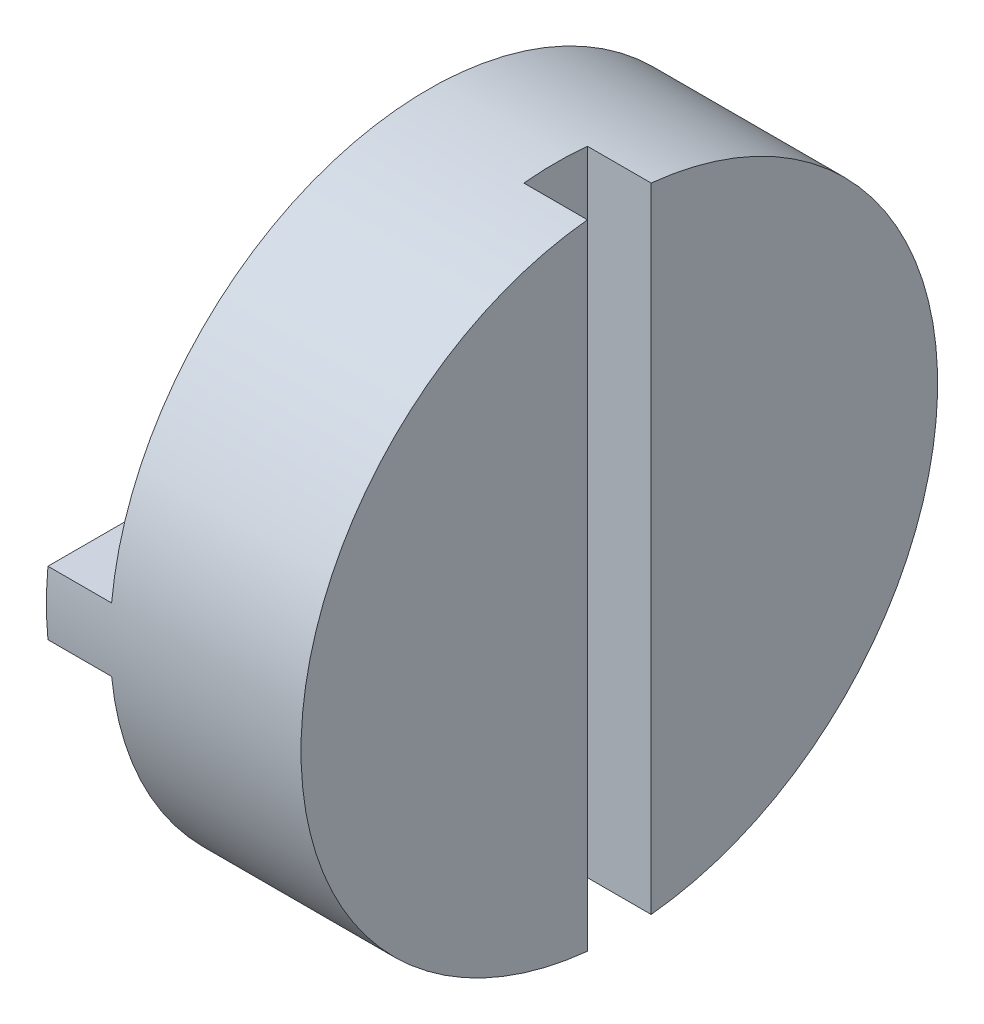
ISO-10303-21;
HEADER;
FILE_DESCRIPTION(('STEP AP214'),'2;1');
FILE_NAME('part.step','',(''),(''),'','','');
FILE_SCHEMA(('AUTOMOTIVE_DESIGN { 1 0 10303 214 1 1 1 1 }'));
ENDSEC;
DATA;
#1=APPLICATION_CONTEXT('core data for automotive mechanical design processes');
#2=APPLICATION_PROTOCOL_DEFINITION('international standard','automotive_design',2000,#1);
#3=PRODUCT_CONTEXT('',#1,'mechanical');
#4=PRODUCT('Part','Part','',(#3));
#5=PRODUCT_RELATED_PRODUCT_CATEGORY('part','',(#4));
#6=PRODUCT_DEFINITION_FORMATION('','',#4);
#7=PRODUCT_DEFINITION_CONTEXT('part definition',#1,'design');
#8=PRODUCT_DEFINITION('design','',#6,#7);
#9=PRODUCT_DEFINITION_SHAPE('','',#8);
#10=(LENGTH_UNIT() NAMED_UNIT(*) SI_UNIT(.MILLI.,.METRE.));
#11=(NAMED_UNIT(*) PLANE_ANGLE_UNIT() SI_UNIT($,.RADIAN.));
#12=(NAMED_UNIT(*) SI_UNIT($,.STERADIAN.) SOLID_ANGLE_UNIT());
#13=UNCERTAINTY_MEASURE_WITH_UNIT(LENGTH_MEASURE(1.E-05),#10,'distance_accuracy_value','');
#14=(GEOMETRIC_REPRESENTATION_CONTEXT(3) GLOBAL_UNCERTAINTY_ASSIGNED_CONTEXT((#13)) GLOBAL_UNIT_ASSIGNED_CONTEXT((#10,
#11,#12)) REPRESENTATION_CONTEXT('',''));
#15=CARTESIAN_POINT('',(0.,0.,0.));
#16=DIRECTION('',(0.,0.,1.));
#17=DIRECTION('',(1.,0.,0.));
#18=AXIS2_PLACEMENT_3D('',#15,#16,#17);
#19=CARTESIAN_POINT('',(-5.,0.,0.));
#20=DIRECTION('',(1.,0.,0.));
#21=DIRECTION('',(0.,0.,-1.));
#22=AXIS2_PLACEMENT_3D('',#19,#20,#21);
#23=PLANE('',#22);
#24=DIRECTION('',(0.,0.,1.));
#25=VECTOR('',#24,1.);
#26=CARTESIAN_POINT('',(-5.,-2.5,-24.8746859276655));
#27=LINE('',#26,#25);
#28=CARTESIAN_POINT('',(-5.,-2.5,-24.8746859276655));
#29=VERTEX_POINT('',#28);
#30=CARTESIAN_POINT('',(-5.,-2.5,24.8746859276655));
#31=VERTEX_POINT('',#30);
#32=EDGE_CURVE('E49',#29,#31,#27,.T.);
#33=ORIENTED_EDGE('',*,*,#32,.F.);
#34=CARTESIAN_POINT('',(-5.,0.,0.));
#35=DIRECTION('',(1.,0.,0.));
#36=DIRECTION('',(0.,0.,-1.));
#37=AXIS2_PLACEMENT_3D('',#34,#35,#36);
#38=CIRCLE('',#37,25.);
#39=EDGE_CURVE('E42',#31,#29,#38,.T.);
#40=ORIENTED_EDGE('',*,*,#39,.F.);
#41=EDGE_LOOP('',(#33,#40));
#42=FACE_BOUND('',#41,.T.);
#43=ADVANCED_FACE('F33',(#42),#23,.F.);
#44=DIRECTION('',(0.,0.,-1.));
#45=VECTOR('',#44,1.);
#46=CARTESIAN_POINT('',(-5.,2.5,-24.8746859276655));
#47=LINE('',#46,#45);
#48=CARTESIAN_POINT('',(-5.,2.5,24.8746859276655));
#49=VERTEX_POINT('',#48);
#50=CARTESIAN_POINT('',(-5.,2.5,-24.8746859276655));
#51=VERTEX_POINT('',#50);
#52=EDGE_CURVE('E130',#49,#51,#47,.T.);
#53=ORIENTED_EDGE('',*,*,#52,.F.);
#54=EDGE_CURVE('E11',#51,#49,#38,.T.);
#55=ORIENTED_EDGE('',*,*,#54,.F.);
#56=EDGE_LOOP('',(#53,#55));
#57=FACE_BOUND('',#56,.T.);
#58=ADVANCED_FACE('F185',(#57),#23,.F.);
#59=CARTESIAN_POINT('',(10.,0.,0.));
#60=DIRECTION('',(1.,0.,0.));
#61=DIRECTION('',(0.,0.,-1.));
#62=AXIS2_PLACEMENT_3D('',#59,#60,#61);
#63=PLANE('',#62);
#64=DIRECTION('',(0.,1.,0.));
#65=VECTOR('',#64,1.);
#66=CARTESIAN_POINT('',(10.,24.8746859276655,-2.5));
#67=LINE('',#66,#65);
#68=CARTESIAN_POINT('',(10.,-24.8746859276655,-2.49999999999999));
#69=VERTEX_POINT('',#68);
#70=CARTESIAN_POINT('',(10.,24.8746859276655,-2.5));
#71=VERTEX_POINT('',#70);
#72=EDGE_CURVE('E119',#69,#71,#67,.T.);
#73=ORIENTED_EDGE('',*,*,#72,.F.);
#74=CARTESIAN_POINT('',(10.,0.,0.));
#75=DIRECTION('',(1.,0.,0.));
#76=DIRECTION('',(0.,0.,-1.));
#77=AXIS2_PLACEMENT_3D('',#74,#75,#76);
#78=CIRCLE('',#77,25.);
#79=EDGE_CURVE('E154',#69,#71,#78,.T.);
#80=ORIENTED_EDGE('',*,*,#79,.T.);
#81=EDGE_LOOP('',(#73,#80));
#82=FACE_BOUND('',#81,.T.);
#83=ADVANCED_FACE('F189',(#82),#63,.T.);
#84=CARTESIAN_POINT('',(-5.,0.,0.));
#85=DIRECTION('',(1.,0.,0.));
#86=DIRECTION('',(0.,0.,-1.));
#87=AXIS2_PLACEMENT_3D('',#84,#85,#86);
#88=CYLINDRICAL_SURFACE('',#87,25.);
#89=DIRECTION('',(1.,0.,0.));
#90=VECTOR('',#89,1.);
#91=CARTESIAN_POINT('',(5.,-24.8746859276655,-2.49999999999999));
#92=LINE('',#91,#90);
#93=CARTESIAN_POINT('',(5.,-24.8746859276655,-2.49999999999999));
#94=VERTEX_POINT('',#93);
#95=EDGE_CURVE('E155',#94,#69,#92,.T.);
#96=ORIENTED_EDGE('',*,*,#95,.F.);
#97=CARTESIAN_POINT('',(5.,0.,0.));
#98=DIRECTION('',(1.,0.,0.));
#99=DIRECTION('',(0.,0.,-1.));
#100=AXIS2_PLACEMENT_3D('',#97,#98,#99);
#101=CIRCLE('',#100,25.);
#102=CARTESIAN_POINT('',(5.,-24.8746859276655,2.5));
#103=VERTEX_POINT('',#102);
#104=EDGE_CURVE('E144',#103,#94,#101,.T.);
#105=ORIENTED_EDGE('',*,*,#104,.F.);
#106=DIRECTION('',(1.,0.,0.));
#107=VECTOR('',#106,1.);
#108=CARTESIAN_POINT('',(5.,-24.8746859276655,2.5));
#109=LINE('',#108,#107);
#110=CARTESIAN_POINT('',(10.,-24.8746859276655,2.5));
#111=VERTEX_POINT('',#110);
#112=EDGE_CURVE('E157',#103,#111,#109,.T.);
#113=ORIENTED_EDGE('',*,*,#112,.T.);
#114=CARTESIAN_POINT('',(10.,24.8746859276655,2.5));
#115=VERTEX_POINT('',#114);
#116=EDGE_CURVE('E162',#115,#111,#78,.T.);
#117=ORIENTED_EDGE('',*,*,#116,.F.);
#118=DIRECTION('',(1.,0.,0.));
#119=VECTOR('',#118,1.);
#120=CARTESIAN_POINT('',(5.,24.8746859276655,2.5));
#121=LINE('',#120,#119);
#122=CARTESIAN_POINT('',(5.,24.8746859276655,2.5));
#123=VERTEX_POINT('',#122);
#124=EDGE_CURVE('E148',#123,#115,#121,.T.);
#125=ORIENTED_EDGE('',*,*,#124,.F.);
#126=CARTESIAN_POINT('',(5.,0.,0.));
#127=DIRECTION('',(1.,0.,0.));
#128=DIRECTION('',(0.,0.,-1.));
#129=AXIS2_PLACEMENT_3D('',#126,#127,#128);
#130=CIRCLE('',#129,25.);
#131=CARTESIAN_POINT('',(5.,24.8746859276655,-2.5));
#132=VERTEX_POINT('',#131);
#133=EDGE_CURVE('E138',#132,#123,#130,.T.);
#134=ORIENTED_EDGE('',*,*,#133,.F.);
#135=DIRECTION('',(1.,0.,0.));
#136=VECTOR('',#135,1.);
#137=CARTESIAN_POINT('',(5.,24.8746859276655,-2.5));
#138=LINE('',#137,#136);
#139=EDGE_CURVE('E151',#132,#71,#138,.T.);
#140=ORIENTED_EDGE('',*,*,#139,.T.);
#141=ORIENTED_EDGE('',*,*,#79,.F.);
#142=EDGE_LOOP('',(#96,#105,#113,#117,#125,#134,#140,#141));
#143=FACE_BOUND('',#142,.T.);
#144=ORIENTED_EDGE('',*,*,#54,.T.);
#145=DIRECTION('',(1.,0.,0.));
#146=VECTOR('',#145,1.);
#147=CARTESIAN_POINT('',(-10.,2.5,24.8746859276655));
#148=LINE('',#147,#146);
#149=CARTESIAN_POINT('',(-10.,2.5,24.8746859276655));
#150=VERTEX_POINT('',#149);
#151=EDGE_CURVE('E101',#150,#49,#148,.T.);
#152=ORIENTED_EDGE('',*,*,#151,.F.);
#153=CARTESIAN_POINT('',(-10.,0.,0.));
#154=DIRECTION('',(-1.,0.,0.));
#155=DIRECTION('',(0.,0.,1.));
#156=AXIS2_PLACEMENT_3D('',#153,#154,#155);
#157=CIRCLE('',#156,25.);
#158=CARTESIAN_POINT('',(-10.,-2.5,24.8746859276655));
#159=VERTEX_POINT('',#158);
#160=EDGE_CURVE('E107',#159,#150,#157,.T.);
#161=ORIENTED_EDGE('',*,*,#160,.F.);
#162=DIRECTION('',(1.,0.,0.));
#163=VECTOR('',#162,1.);
#164=CARTESIAN_POINT('',(-10.,-2.5,24.8746859276655));
#165=LINE('',#164,#163);
#166=EDGE_CURVE('E131',#159,#31,#165,.T.);
#167=ORIENTED_EDGE('',*,*,#166,.T.);
#168=ORIENTED_EDGE('',*,*,#39,.T.);
#169=DIRECTION('',(1.,0.,0.));
#170=VECTOR('',#169,1.);
#171=CARTESIAN_POINT('',(-10.,-2.5,-24.8746859276655));
#172=LINE('',#171,#170);
#173=CARTESIAN_POINT('',(-10.,-2.5,-24.8746859276655));
#174=VERTEX_POINT('',#173);
#175=EDGE_CURVE('E121',#174,#29,#172,.T.);
#176=ORIENTED_EDGE('',*,*,#175,.F.);
#177=CARTESIAN_POINT('',(-10.,0.,0.));
#178=DIRECTION('',(-1.,0.,0.));
#179=DIRECTION('',(0.,0.,1.));
#180=AXIS2_PLACEMENT_3D('',#177,#178,#179);
#181=CIRCLE('',#180,25.);
#182=CARTESIAN_POINT('',(-10.,2.5,-24.8746859276655));
#183=VERTEX_POINT('',#182);
#184=EDGE_CURVE('E106',#183,#174,#181,.T.);
#185=ORIENTED_EDGE('',*,*,#184,.F.);
#186=DIRECTION('',(1.,0.,0.));
#187=VECTOR('',#186,1.);
#188=CARTESIAN_POINT('',(-10.,2.5,-24.8746859276655));
#189=LINE('',#188,#187);
#190=EDGE_CURVE('E103',#183,#51,#189,.T.);
#191=ORIENTED_EDGE('',*,*,#190,.T.);
#192=EDGE_LOOP('',(#144,#152,#161,#167,#168,#176,#185,#191));
#193=FACE_BOUND('',#192,.T.);
#194=ADVANCED_FACE('F35',(#143,#193),#88,.T.);
#195=DIRECTION('',(0.,-1.,0.));
#196=VECTOR('',#195,1.);
#197=CARTESIAN_POINT('',(10.,24.8746859276655,2.5));
#198=LINE('',#197,#196);
#199=EDGE_CURVE('E117',#115,#111,#198,.T.);
#200=ORIENTED_EDGE('',*,*,#199,.F.);
#201=ORIENTED_EDGE('',*,*,#116,.T.);
#202=EDGE_LOOP('',(#200,#201));
#203=FACE_BOUND('',#202,.T.);
#204=ADVANCED_FACE('F191',(#203),#63,.T.);
#205=CARTESIAN_POINT('',(5.,24.8746859276655,-2.5));
#206=DIRECTION('',(0.,0.,-1.));
#207=DIRECTION('',(0.,1.,0.));
#208=AXIS2_PLACEMENT_3D('',#205,#206,#207);
#209=PLANE('',#208);
#210=ORIENTED_EDGE('',*,*,#72,.T.);
#211=ORIENTED_EDGE('',*,*,#139,.F.);
#212=DIRECTION('',(0.,1.,0.));
#213=VECTOR('',#212,1.);
#214=CARTESIAN_POINT('',(5.,24.8746859276655,-2.5));
#215=LINE('',#214,#213);
#216=EDGE_CURVE('E146',#94,#132,#215,.T.);
#217=ORIENTED_EDGE('',*,*,#216,.F.);
#218=ORIENTED_EDGE('',*,*,#95,.T.);
#219=EDGE_LOOP('',(#210,#211,#217,#218));
#220=FACE_BOUND('',#219,.T.);
#221=ADVANCED_FACE('F194',(#220),#209,.F.);
#222=CARTESIAN_POINT('',(5.,24.8746859276655,2.5));
#223=DIRECTION('',(0.,0.,1.));
#224=DIRECTION('',(0.,-1.,0.));
#225=AXIS2_PLACEMENT_3D('',#222,#223,#224);
#226=PLANE('',#225);
#227=ORIENTED_EDGE('',*,*,#199,.T.);
#228=ORIENTED_EDGE('',*,*,#112,.F.);
#229=DIRECTION('',(0.,-1.,0.));
#230=VECTOR('',#229,1.);
#231=CARTESIAN_POINT('',(5.,24.8746859276655,2.5));
#232=LINE('',#231,#230);
#233=EDGE_CURVE('E141',#123,#103,#232,.T.);
#234=ORIENTED_EDGE('',*,*,#233,.F.);
#235=ORIENTED_EDGE('',*,*,#124,.T.);
#236=EDGE_LOOP('',(#227,#228,#234,#235));
#237=FACE_BOUND('',#236,.T.);
#238=ADVANCED_FACE('F196',(#237),#226,.F.);
#239=CARTESIAN_POINT('',(5.,0.,0.));
#240=DIRECTION('',(1.,0.,0.));
#241=DIRECTION('',(0.,0.,-1.));
#242=AXIS2_PLACEMENT_3D('',#239,#240,#241);
#243=PLANE('',#242);
#244=ORIENTED_EDGE('',*,*,#133,.T.);
#245=ORIENTED_EDGE('',*,*,#233,.T.);
#246=ORIENTED_EDGE('',*,*,#104,.T.);
#247=ORIENTED_EDGE('',*,*,#216,.T.);
#248=EDGE_LOOP('',(#244,#245,#246,#247));
#249=FACE_BOUND('',#248,.T.);
#250=ADVANCED_FACE('F182',(#249),#243,.T.);
#251=CARTESIAN_POINT('',(-10.,2.5,-24.8746859276655));
#252=DIRECTION('',(0.,-1.,0.));
#253=DIRECTION('',(0.,0.,-1.));
#254=AXIS2_PLACEMENT_3D('',#251,#252,#253);
#255=PLANE('',#254);
#256=ORIENTED_EDGE('',*,*,#52,.T.);
#257=ORIENTED_EDGE('',*,*,#190,.F.);
#258=DIRECTION('',(0.,0.,-1.));
#259=VECTOR('',#258,1.);
#260=CARTESIAN_POINT('',(-10.,2.5,-24.8746859276655));
#261=LINE('',#260,#259);
#262=EDGE_CURVE('E96',#150,#183,#261,.T.);
#263=ORIENTED_EDGE('',*,*,#262,.F.);
#264=ORIENTED_EDGE('',*,*,#151,.T.);
#265=EDGE_LOOP('',(#256,#257,#263,#264));
#266=FACE_BOUND('',#265,.T.);
#267=ADVANCED_FACE('F99',(#266),#255,.F.);
#268=CARTESIAN_POINT('',(-10.,-2.5,-24.8746859276655));
#269=DIRECTION('',(0.,1.,0.));
#270=DIRECTION('',(0.,0.,1.));
#271=AXIS2_PLACEMENT_3D('',#268,#269,#270);
#272=PLANE('',#271);
#273=ORIENTED_EDGE('',*,*,#32,.T.);
#274=ORIENTED_EDGE('',*,*,#166,.F.);
#275=DIRECTION('',(0.,0.,1.));
#276=VECTOR('',#275,1.);
#277=CARTESIAN_POINT('',(-10.,-2.5,-24.8746859276655));
#278=LINE('',#277,#276);
#279=EDGE_CURVE('E112',#174,#159,#278,.T.);
#280=ORIENTED_EDGE('',*,*,#279,.F.);
#281=ORIENTED_EDGE('',*,*,#175,.T.);
#282=EDGE_LOOP('',(#273,#274,#280,#281));
#283=FACE_BOUND('',#282,.T.);
#284=ADVANCED_FACE('F174',(#283),#272,.F.);
#285=CARTESIAN_POINT('',(-10.,0.,0.));
#286=DIRECTION('',(-1.,0.,0.));
#287=DIRECTION('',(0.,0.,1.));
#288=AXIS2_PLACEMENT_3D('',#285,#286,#287);
#289=PLANE('',#288);
#290=ORIENTED_EDGE('',*,*,#160,.T.);
#291=ORIENTED_EDGE('',*,*,#262,.T.);
#292=ORIENTED_EDGE('',*,*,#184,.T.);
#293=ORIENTED_EDGE('',*,*,#279,.T.);
#294=EDGE_LOOP('',(#290,#291,#292,#293));
#295=FACE_BOUND('',#294,.T.);
#296=ADVANCED_FACE('F110',(#295),#289,.T.);
#297=CLOSED_SHELL('',(#43,#58,#83,#194,#204,#221,#238,#250,#267,#284,#296));
#298=MANIFOLD_SOLID_BREP('B2',#297);
#299=ADVANCED_BREP_SHAPE_REPRESENTATION('',(#18,#298),#14);
#300=SHAPE_DEFINITION_REPRESENTATION(#9,#299);
ENDSEC;
END-ISO-10303-21;
